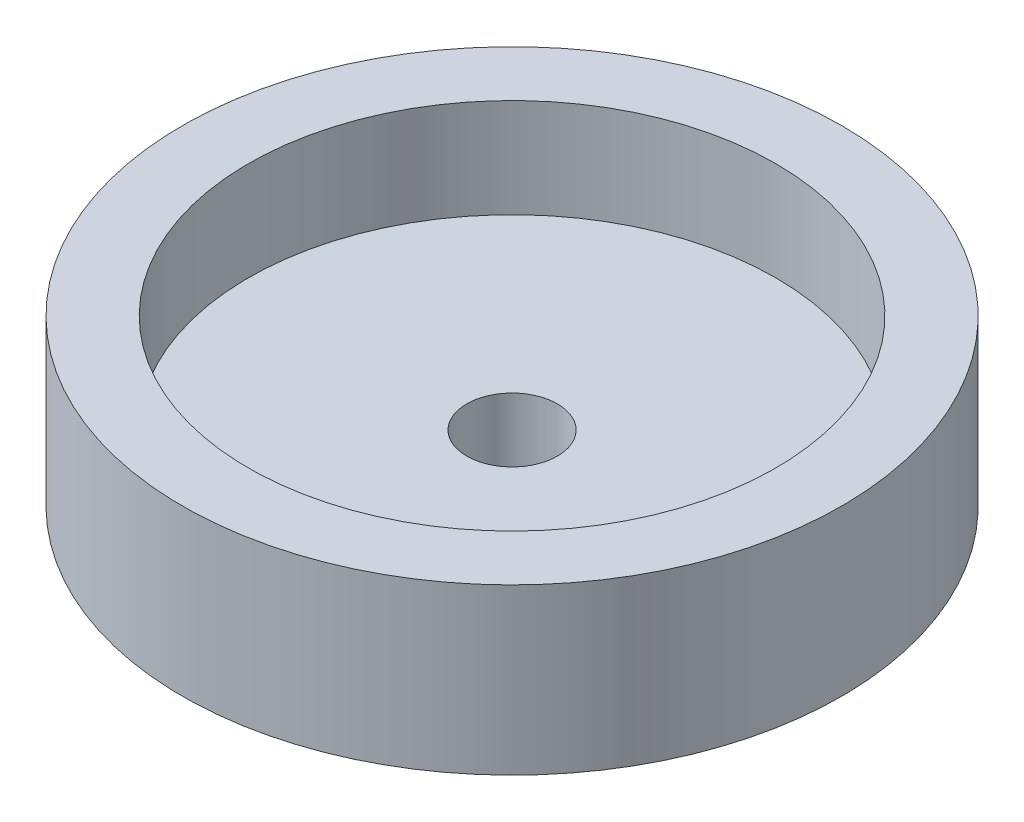
ISO-10303-21;
HEADER;
FILE_DESCRIPTION(('STEP AP214'),'2;1');
FILE_NAME('part.step','',(''),(''),'','','');
FILE_SCHEMA(('AUTOMOTIVE_DESIGN { 1 0 10303 214 1 1 1 1 }'));
ENDSEC;
DATA;
#1=APPLICATION_CONTEXT('core data for automotive mechanical design processes');
#2=APPLICATION_PROTOCOL_DEFINITION('international standard','automotive_design',2000,#1);
#3=PRODUCT_CONTEXT('',#1,'mechanical');
#4=PRODUCT('Part','Part','',(#3));
#5=PRODUCT_RELATED_PRODUCT_CATEGORY('part','',(#4));
#6=PRODUCT_DEFINITION_FORMATION('','',#4);
#7=PRODUCT_DEFINITION_CONTEXT('part definition',#1,'design');
#8=PRODUCT_DEFINITION('design','',#6,#7);
#9=PRODUCT_DEFINITION_SHAPE('','',#8);
#10=(LENGTH_UNIT() NAMED_UNIT(*) SI_UNIT(.MILLI.,.METRE.));
#11=(NAMED_UNIT(*) PLANE_ANGLE_UNIT() SI_UNIT($,.RADIAN.));
#12=(NAMED_UNIT(*) SI_UNIT($,.STERADIAN.) SOLID_ANGLE_UNIT());
#13=UNCERTAINTY_MEASURE_WITH_UNIT(LENGTH_MEASURE(1.E-05),#10,'distance_accuracy_value','');
#14=(GEOMETRIC_REPRESENTATION_CONTEXT(3) GLOBAL_UNCERTAINTY_ASSIGNED_CONTEXT((#13)) GLOBAL_UNIT_ASSIGNED_CONTEXT((#10,
#11,#12)) REPRESENTATION_CONTEXT('',''));
#15=CARTESIAN_POINT('',(0.,0.,0.));
#16=DIRECTION('',(0.,0.,1.));
#17=DIRECTION('',(1.,0.,0.));
#18=AXIS2_PLACEMENT_3D('',#15,#16,#17);
#19=CARTESIAN_POINT('',(0.,4.,0.));
#20=DIRECTION('',(0.,-1.,0.));
#21=DIRECTION('',(0.,0.,-1.));
#22=AXIS2_PLACEMENT_3D('',#19,#20,#21);
#23=PLANE('',#22);
#24=CARTESIAN_POINT('',(0.,4.,0.));
#25=DIRECTION('',(0.,1.,0.));
#26=DIRECTION('',(0.,0.,1.));
#27=AXIS2_PLACEMENT_3D('',#24,#25,#26);
#28=CIRCLE('',#27,2.75);
#29=CARTESIAN_POINT('',(0.,4.,2.75));
#30=VERTEX_POINT('',#29);
#31=EDGE_CURVE('E66',#30,#30,#28,.T.);
#32=ORIENTED_EDGE('',*,*,#31,.F.);
#33=EDGE_LOOP('',(#32));
#34=FACE_BOUND('',#33,.T.);
#35=CARTESIAN_POINT('',(0.,4.,0.));
#36=DIRECTION('',(0.,-1.,0.));
#37=DIRECTION('',(0.,0.,-1.));
#38=AXIS2_PLACEMENT_3D('',#35,#36,#37);
#39=CIRCLE('',#38,16.);
#40=CARTESIAN_POINT('',(0.,4.,-16.));
#41=VERTEX_POINT('',#40);
#42=EDGE_CURVE('E10',#41,#41,#39,.T.);
#43=ORIENTED_EDGE('',*,*,#42,.F.);
#44=EDGE_LOOP('',(#43));
#45=FACE_BOUND('',#44,.T.);
#46=ADVANCED_FACE('F39',(#34,#45),#23,.F.);
#47=CARTESIAN_POINT('',(0.,0.,0.));
#48=DIRECTION('',(0.,-1.,0.));
#49=DIRECTION('',(0.,0.,-1.));
#50=AXIS2_PLACEMENT_3D('',#47,#48,#49);
#51=CYLINDRICAL_SURFACE('',#50,16.);
#52=ORIENTED_EDGE('',*,*,#42,.T.);
#53=EDGE_LOOP('',(#52));
#54=FACE_BOUND('',#53,.T.);
#55=CARTESIAN_POINT('',(0.,10.,0.));
#56=DIRECTION('',(0.,-1.,0.));
#57=DIRECTION('',(0.,0.,-1.));
#58=AXIS2_PLACEMENT_3D('',#55,#56,#57);
#59=CIRCLE('',#58,16.);
#60=CARTESIAN_POINT('',(0.,10.,-16.));
#61=VERTEX_POINT('',#60);
#62=EDGE_CURVE('E46',#61,#61,#59,.T.);
#63=ORIENTED_EDGE('',*,*,#62,.F.);
#64=EDGE_LOOP('',(#63));
#65=FACE_BOUND('',#64,.T.);
#66=ADVANCED_FACE('F75',(#54,#65),#51,.F.);
#67=CARTESIAN_POINT('',(0.,10.,0.));
#68=DIRECTION('',(0.,1.,0.));
#69=DIRECTION('',(0.,0.,1.));
#70=AXIS2_PLACEMENT_3D('',#67,#68,#69);
#71=PLANE('',#70);
#72=ORIENTED_EDGE('',*,*,#62,.T.);
#73=EDGE_LOOP('',(#72));
#74=FACE_BOUND('',#73,.T.);
#75=CARTESIAN_POINT('',(0.,10.,0.));
#76=DIRECTION('',(0.,-1.,0.));
#77=DIRECTION('',(0.,0.,-1.));
#78=AXIS2_PLACEMENT_3D('',#75,#76,#77);
#79=CIRCLE('',#78,20.);
#80=CARTESIAN_POINT('',(0.,10.,-20.));
#81=VERTEX_POINT('',#80);
#82=EDGE_CURVE('E51',#81,#81,#79,.T.);
#83=ORIENTED_EDGE('',*,*,#82,.F.);
#84=EDGE_LOOP('',(#83));
#85=FACE_BOUND('',#84,.T.);
#86=ADVANCED_FACE('F79',(#74,#85),#71,.T.);
#87=CARTESIAN_POINT('',(0.,0.,0.));
#88=DIRECTION('',(0.,-1.,0.));
#89=DIRECTION('',(0.,0.,-1.));
#90=AXIS2_PLACEMENT_3D('',#87,#88,#89);
#91=CYLINDRICAL_SURFACE('',#90,20.);
#92=CARTESIAN_POINT('',(0.,0.,0.));
#93=DIRECTION('',(0.,-1.,0.));
#94=DIRECTION('',(0.,0.,-1.));
#95=AXIS2_PLACEMENT_3D('',#92,#93,#94);
#96=CIRCLE('',#95,20.);
#97=CARTESIAN_POINT('',(0.,0.,-20.));
#98=VERTEX_POINT('',#97);
#99=EDGE_CURVE('E56',#98,#98,#96,.T.);
#100=ORIENTED_EDGE('',*,*,#99,.F.);
#101=EDGE_LOOP('',(#100));
#102=FACE_BOUND('',#101,.T.);
#103=ORIENTED_EDGE('',*,*,#82,.T.);
#104=EDGE_LOOP('',(#103));
#105=FACE_BOUND('',#104,.T.);
#106=ADVANCED_FACE('F83',(#102,#105),#91,.T.);
#107=CARTESIAN_POINT('',(0.,0.,0.));
#108=DIRECTION('',(0.,-1.,0.));
#109=DIRECTION('',(0.,0.,-1.));
#110=AXIS2_PLACEMENT_3D('',#107,#108,#109);
#111=PLANE('',#110);
#112=CARTESIAN_POINT('',(0.,0.,0.));
#113=DIRECTION('',(0.,1.,0.));
#114=DIRECTION('',(0.,0.,1.));
#115=AXIS2_PLACEMENT_3D('',#112,#113,#114);
#116=CIRCLE('',#115,2.75);
#117=CARTESIAN_POINT('',(0.,0.,2.75));
#118=VERTEX_POINT('',#117);
#119=EDGE_CURVE('E62',#118,#118,#116,.T.);
#120=ORIENTED_EDGE('',*,*,#119,.T.);
#121=EDGE_LOOP('',(#120));
#122=FACE_BOUND('',#121,.T.);
#123=ORIENTED_EDGE('',*,*,#99,.T.);
#124=EDGE_LOOP('',(#123));
#125=FACE_BOUND('',#124,.T.);
#126=ADVANCED_FACE('F89',(#122,#125),#111,.T.);
#127=CARTESIAN_POINT('',(0.,4.,0.));
#128=DIRECTION('',(0.,1.,0.));
#129=DIRECTION('',(0.,0.,1.));
#130=AXIS2_PLACEMENT_3D('',#127,#128,#129);
#131=CYLINDRICAL_SURFACE('',#130,2.75);
#132=ORIENTED_EDGE('',*,*,#119,.F.);
#133=EDGE_LOOP('',(#132));
#134=FACE_BOUND('',#133,.T.);
#135=ORIENTED_EDGE('',*,*,#31,.T.);
#136=EDGE_LOOP('',(#135));
#137=FACE_BOUND('',#136,.T.);
#138=ADVANCED_FACE('F71',(#134,#137),#131,.F.);
#139=CLOSED_SHELL('',(#46,#66,#86,#106,#126,#138));
#140=MANIFOLD_SOLID_BREP('B2',#139);
#141=ADVANCED_BREP_SHAPE_REPRESENTATION('',(#18,#140),#14);
#142=SHAPE_DEFINITION_REPRESENTATION(#9,#141);
ENDSEC;
END-ISO-10303-21;
